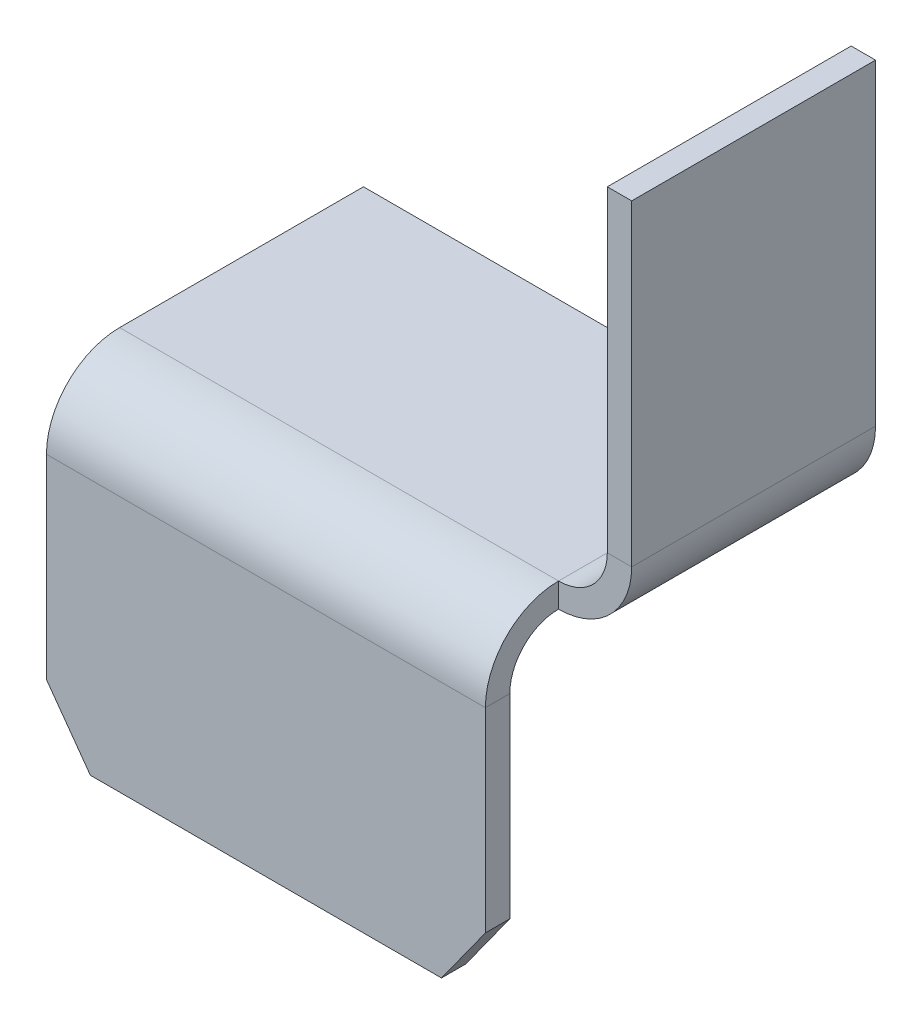
ISO-10303-21;
HEADER;
FILE_DESCRIPTION(('STEP AP214'),'2;1');
FILE_NAME('part.step','',(''),(''),'','','');
FILE_SCHEMA(('AUTOMOTIVE_DESIGN { 1 0 10303 214 1 1 1 1 }'));
ENDSEC;
DATA;
#1=APPLICATION_CONTEXT('core data for automotive mechanical design processes');
#2=APPLICATION_PROTOCOL_DEFINITION('international standard','automotive_design',2000,#1);
#3=PRODUCT_CONTEXT('',#1,'mechanical');
#4=PRODUCT('Part','Part','',(#3));
#5=PRODUCT_RELATED_PRODUCT_CATEGORY('part','',(#4));
#6=PRODUCT_DEFINITION_FORMATION('','',#4);
#7=PRODUCT_DEFINITION_CONTEXT('part definition',#1,'design');
#8=PRODUCT_DEFINITION('design','',#6,#7);
#9=PRODUCT_DEFINITION_SHAPE('','',#8);
#10=(LENGTH_UNIT() NAMED_UNIT(*) SI_UNIT(.MILLI.,.METRE.));
#11=(NAMED_UNIT(*) PLANE_ANGLE_UNIT() SI_UNIT($,.RADIAN.));
#12=(NAMED_UNIT(*) SI_UNIT($,.STERADIAN.) SOLID_ANGLE_UNIT());
#13=UNCERTAINTY_MEASURE_WITH_UNIT(LENGTH_MEASURE(1.E-05),#10,'distance_accuracy_value','');
#14=(GEOMETRIC_REPRESENTATION_CONTEXT(3) GLOBAL_UNCERTAINTY_ASSIGNED_CONTEXT((#13)) GLOBAL_UNIT_ASSIGNED_CONTEXT((#10,
#11,#12)) REPRESENTATION_CONTEXT('',''));
#15=CARTESIAN_POINT('',(0.,0.,0.));
#16=DIRECTION('',(0.,0.,1.));
#17=DIRECTION('',(1.,0.,0.));
#18=AXIS2_PLACEMENT_3D('',#15,#16,#17);
#19=CARTESIAN_POINT('',(20.,2.,10.));
#20=DIRECTION('',(0.,0.,1.));
#21=DIRECTION('',(1.,0.,0.));
#22=AXIS2_PLACEMENT_3D('',#19,#20,#21);
#23=PLANE('',#22);
#24=DIRECTION('',(1.,0.,0.));
#25=VECTOR('',#24,1.);
#26=CARTESIAN_POINT('',(20.,2.,10.));
#27=LINE('',#26,#25);
#28=CARTESIAN_POINT('',(20.,2.,10.));
#29=VERTEX_POINT('',#28);
#30=CARTESIAN_POINT('',(21.,2.,10.));
#31=VERTEX_POINT('',#30);
#32=EDGE_CURVE('E13',#29,#31,#27,.T.);
#33=ORIENTED_EDGE('',*,*,#32,.F.);
#34=CARTESIAN_POINT('',(18.,2.,10.));
#35=DIRECTION('',(0.,0.,-1.));
#36=DIRECTION('',(-1.,0.,0.));
#37=AXIS2_PLACEMENT_3D('',#34,#35,#36);
#38=CIRCLE('',#37,2.);
#39=CARTESIAN_POINT('',(18.,0.,10.));
#40=VERTEX_POINT('',#39);
#41=EDGE_CURVE('E138',#40,#29,#38,.F.);
#42=ORIENTED_EDGE('',*,*,#41,.F.);
#43=DIRECTION('',(0.,1.,0.));
#44=VECTOR('',#43,1.);
#45=CARTESIAN_POINT('',(18.,-1.,10.));
#46=LINE('',#45,#44);
#47=CARTESIAN_POINT('',(18.,-0.999999999999999,10.));
#48=VERTEX_POINT('',#47);
#49=EDGE_CURVE('E78',#48,#40,#46,.T.);
#50=ORIENTED_EDGE('',*,*,#49,.F.);
#51=CARTESIAN_POINT('',(18.,2.,10.));
#52=DIRECTION('',(0.,0.,1.));
#53=DIRECTION('',(1.,0.,0.));
#54=AXIS2_PLACEMENT_3D('',#51,#52,#53);
#55=CIRCLE('',#54,3.);
#56=EDGE_CURVE('E141',#48,#31,#55,.T.);
#57=ORIENTED_EDGE('',*,*,#56,.T.);
#58=EDGE_LOOP('',(#33,#42,#50,#57));
#59=FACE_BOUND('',#58,.T.);
#60=ADVANCED_FACE('F72',(#59),#23,.T.);
#61=CARTESIAN_POINT('',(18.,-1.,10.));
#62=DIRECTION('',(0.,0.,1.));
#63=DIRECTION('',(1.,0.,0.));
#64=AXIS2_PLACEMENT_3D('',#61,#62,#63);
#65=PLANE('',#64);
#66=DIRECTION('',(0.,1.,0.));
#67=VECTOR('',#66,1.);
#68=CARTESIAN_POINT('',(20.,0.,10.));
#69=LINE('',#68,#67);
#70=CARTESIAN_POINT('',(20.,15.,10.));
#71=VERTEX_POINT('',#70);
#72=EDGE_CURVE('E151',#29,#71,#69,.T.);
#73=ORIENTED_EDGE('',*,*,#72,.F.);
#74=ORIENTED_EDGE('',*,*,#32,.T.);
#75=DIRECTION('',(0.,1.,0.));
#76=VECTOR('',#75,1.);
#77=CARTESIAN_POINT('',(21.,0.,10.));
#78=LINE('',#77,#76);
#79=CARTESIAN_POINT('',(21.,15.,10.));
#80=VERTEX_POINT('',#79);
#81=EDGE_CURVE('E126',#31,#80,#78,.T.);
#82=ORIENTED_EDGE('',*,*,#81,.T.);
#83=DIRECTION('',(1.,0.,0.));
#84=VECTOR('',#83,1.);
#85=CARTESIAN_POINT('',(20.,15.,10.));
#86=LINE('',#85,#84);
#87=EDGE_CURVE('E161',#71,#80,#86,.T.);
#88=ORIENTED_EDGE('',*,*,#87,.F.);
#89=EDGE_LOOP('',(#73,#74,#82,#88));
#90=FACE_BOUND('',#89,.T.);
#91=ADVANCED_FACE('F157',(#90),#65,.T.);
#92=CARTESIAN_POINT('',(18.,0.,0.));
#93=DIRECTION('',(0.,0.,-1.));
#94=DIRECTION('',(-1.,0.,0.));
#95=AXIS2_PLACEMENT_3D('',#92,#93,#94);
#96=PLANE('',#95);
#97=DIRECTION('',(0.,-1.,0.));
#98=VECTOR('',#97,1.);
#99=CARTESIAN_POINT('',(18.,0.,0.));
#100=LINE('',#99,#98);
#101=CARTESIAN_POINT('',(18.,0.,0.));
#102=VERTEX_POINT('',#101);
#103=CARTESIAN_POINT('',(18.,-1.,0.));
#104=VERTEX_POINT('',#103);
#105=EDGE_CURVE('E113',#102,#104,#100,.T.);
#106=ORIENTED_EDGE('',*,*,#105,.F.);
#107=CARTESIAN_POINT('',(18.,2.,0.));
#108=DIRECTION('',(0.,0.,-1.));
#109=DIRECTION('',(-1.,0.,0.));
#110=AXIS2_PLACEMENT_3D('',#107,#108,#109);
#111=CIRCLE('',#110,2.);
#112=CARTESIAN_POINT('',(20.,2.,0.));
#113=VERTEX_POINT('',#112);
#114=EDGE_CURVE('E187',#102,#113,#111,.F.);
#115=ORIENTED_EDGE('',*,*,#114,.T.);
#116=DIRECTION('',(-1.,0.,0.));
#117=VECTOR('',#116,1.);
#118=CARTESIAN_POINT('',(21.,2.,0.));
#119=LINE('',#118,#117);
#120=CARTESIAN_POINT('',(21.,2.,0.));
#121=VERTEX_POINT('',#120);
#122=EDGE_CURVE('E124',#121,#113,#119,.T.);
#123=ORIENTED_EDGE('',*,*,#122,.F.);
#124=CARTESIAN_POINT('',(18.,2.,0.));
#125=DIRECTION('',(0.,0.,1.));
#126=DIRECTION('',(1.,0.,0.));
#127=AXIS2_PLACEMENT_3D('',#124,#125,#126);
#128=CIRCLE('',#127,3.);
#129=EDGE_CURVE('E198',#104,#121,#128,.T.);
#130=ORIENTED_EDGE('',*,*,#129,.F.);
#131=EDGE_LOOP('',(#106,#115,#123,#130));
#132=FACE_BOUND('',#131,.T.);
#133=ADVANCED_FACE('F365',(#132),#96,.T.);
#134=CARTESIAN_POINT('',(21.,2.,0.));
#135=DIRECTION('',(0.,0.,-1.));
#136=DIRECTION('',(-1.,0.,0.));
#137=AXIS2_PLACEMENT_3D('',#134,#135,#136);
#138=PLANE('',#137);
#139=DIRECTION('',(1.,0.,0.));
#140=VECTOR('',#139,1.);
#141=CARTESIAN_POINT('',(0.,0.,0.));
#142=LINE('',#141,#140);
#143=CARTESIAN_POINT('',(0.,0.,0.));
#144=VERTEX_POINT('',#143);
#145=EDGE_CURVE('E188',#144,#102,#142,.T.);
#146=ORIENTED_EDGE('',*,*,#145,.T.);
#147=ORIENTED_EDGE('',*,*,#105,.T.);
#148=DIRECTION('',(1.,0.,0.));
#149=VECTOR('',#148,1.);
#150=CARTESIAN_POINT('',(0.,-1.,0.));
#151=LINE('',#150,#149);
#152=CARTESIAN_POINT('',(0.,-1.,0.));
#153=VERTEX_POINT('',#152);
#154=EDGE_CURVE('E191',#153,#104,#151,.T.);
#155=ORIENTED_EDGE('',*,*,#154,.F.);
#156=DIRECTION('',(0.,1.,0.));
#157=VECTOR('',#156,1.);
#158=CARTESIAN_POINT('',(0.,-1.,0.));
#159=LINE('',#158,#157);
#160=EDGE_CURVE('E192',#153,#144,#159,.T.);
#161=ORIENTED_EDGE('',*,*,#160,.T.);
#162=EDGE_LOOP('',(#146,#147,#155,#161));
#163=FACE_BOUND('',#162,.T.);
#164=ADVANCED_FACE('F362',(#163),#138,.T.);
#165=CARTESIAN_POINT('',(21.,0.,10.));
#166=DIRECTION('',(-1.,0.,0.));
#167=DIRECTION('',(0.,0.,1.));
#168=AXIS2_PLACEMENT_3D('',#165,#166,#167);
#169=PLANE('',#168);
#170=DIRECTION('',(0.,1.,0.));
#171=VECTOR('',#170,1.);
#172=CARTESIAN_POINT('',(21.,0.,0.));
#173=LINE('',#172,#171);
#174=CARTESIAN_POINT('',(21.,15.,0.));
#175=VERTEX_POINT('',#174);
#176=EDGE_CURVE('E176',#121,#175,#173,.T.);
#177=ORIENTED_EDGE('',*,*,#176,.T.);
#178=DIRECTION('',(0.,0.,-1.));
#179=VECTOR('',#178,1.);
#180=CARTESIAN_POINT('',(21.,15.,10.));
#181=LINE('',#180,#179);
#182=EDGE_CURVE('E207',#80,#175,#181,.T.);
#183=ORIENTED_EDGE('',*,*,#182,.F.);
#184=ORIENTED_EDGE('',*,*,#81,.F.);
#185=DIRECTION('',(0.,0.,-1.));
#186=VECTOR('',#185,1.);
#187=CARTESIAN_POINT('',(21.,2.,10.));
#188=LINE('',#187,#186);
#189=EDGE_CURVE('E180',#31,#121,#188,.T.);
#190=ORIENTED_EDGE('',*,*,#189,.T.);
#191=EDGE_LOOP('',(#177,#183,#184,#190));
#192=FACE_BOUND('',#191,.T.);
#193=ADVANCED_FACE('F235',(#192),#169,.F.);
#194=CARTESIAN_POINT('',(20.,15.,10.));
#195=DIRECTION('',(0.,1.,0.));
#196=DIRECTION('',(0.,0.,1.));
#197=AXIS2_PLACEMENT_3D('',#194,#195,#196);
#198=PLANE('',#197);
#199=DIRECTION('',(1.,0.,0.));
#200=VECTOR('',#199,1.);
#201=CARTESIAN_POINT('',(20.,15.,0.));
#202=LINE('',#201,#200);
#203=CARTESIAN_POINT('',(20.,15.,0.));
#204=VERTEX_POINT('',#203);
#205=EDGE_CURVE('E185',#204,#175,#202,.T.);
#206=ORIENTED_EDGE('',*,*,#205,.F.);
#207=DIRECTION('',(0.,0.,-1.));
#208=VECTOR('',#207,1.);
#209=CARTESIAN_POINT('',(20.,15.,10.));
#210=LINE('',#209,#208);
#211=EDGE_CURVE('E156',#71,#204,#210,.T.);
#212=ORIENTED_EDGE('',*,*,#211,.F.);
#213=ORIENTED_EDGE('',*,*,#87,.T.);
#214=ORIENTED_EDGE('',*,*,#182,.T.);
#215=EDGE_LOOP('',(#206,#212,#213,#214));
#216=FACE_BOUND('',#215,.T.);
#217=ADVANCED_FACE('F367',(#216),#198,.T.);
#218=CARTESIAN_POINT('',(20.,0.,10.));
#219=DIRECTION('',(-1.,0.,0.));
#220=DIRECTION('',(0.,0.,1.));
#221=AXIS2_PLACEMENT_3D('',#218,#219,#220);
#222=PLANE('',#221);
#223=DIRECTION('',(0.,1.,0.));
#224=VECTOR('',#223,1.);
#225=CARTESIAN_POINT('',(20.,0.,0.));
#226=LINE('',#225,#224);
#227=EDGE_CURVE('E153',#113,#204,#226,.T.);
#228=ORIENTED_EDGE('',*,*,#227,.F.);
#229=DIRECTION('',(0.,0.,-1.));
#230=VECTOR('',#229,1.);
#231=CARTESIAN_POINT('',(20.,2.,10.));
#232=LINE('',#231,#230);
#233=EDGE_CURVE('E149',#29,#113,#232,.T.);
#234=ORIENTED_EDGE('',*,*,#233,.F.);
#235=ORIENTED_EDGE('',*,*,#72,.T.);
#236=ORIENTED_EDGE('',*,*,#211,.T.);
#237=EDGE_LOOP('',(#228,#234,#235,#236));
#238=FACE_BOUND('',#237,.T.);
#239=ADVANCED_FACE('F147',(#238),#222,.T.);
#240=CARTESIAN_POINT('',(18.,2.,10.));
#241=DIRECTION('',(0.,0.,-1.));
#242=DIRECTION('',(-1.,0.,0.));
#243=AXIS2_PLACEMENT_3D('',#240,#241,#242);
#244=CYLINDRICAL_SURFACE('',#243,2.);
#245=ORIENTED_EDGE('',*,*,#114,.F.);
#246=DIRECTION('',(0.,0.,-1.));
#247=VECTOR('',#246,1.);
#248=CARTESIAN_POINT('',(18.,0.,10.));
#249=LINE('',#248,#247);
#250=EDGE_CURVE('E160',#40,#102,#249,.T.);
#251=ORIENTED_EDGE('',*,*,#250,.F.);
#252=ORIENTED_EDGE('',*,*,#41,.T.);
#253=ORIENTED_EDGE('',*,*,#233,.T.);
#254=EDGE_LOOP('',(#245,#251,#252,#253));
#255=FACE_BOUND('',#254,.T.);
#256=ADVANCED_FACE('F163',(#255),#244,.F.);
#257=CARTESIAN_POINT('',(0.,0.,10.));
#258=DIRECTION('',(0.,1.,0.));
#259=DIRECTION('',(0.,0.,1.));
#260=AXIS2_PLACEMENT_3D('',#257,#258,#259);
#261=PLANE('',#260);
#262=ORIENTED_EDGE('',*,*,#145,.F.);
#263=DIRECTION('',(0.,0.,-1.));
#264=VECTOR('',#263,1.);
#265=CARTESIAN_POINT('',(0.,0.,10.));
#266=LINE('',#265,#264);
#267=CARTESIAN_POINT('',(0.,0.,10.));
#268=VERTEX_POINT('',#267);
#269=EDGE_CURVE('E202',#268,#144,#266,.T.);
#270=ORIENTED_EDGE('',*,*,#269,.F.);
#271=DIRECTION('',(1.,0.,0.));
#272=VECTOR('',#271,1.);
#273=CARTESIAN_POINT('',(0.,0.,10.));
#274=LINE('',#273,#272);
#275=EDGE_CURVE('E167',#268,#40,#274,.T.);
#276=ORIENTED_EDGE('',*,*,#275,.T.);
#277=ORIENTED_EDGE('',*,*,#250,.T.);
#278=EDGE_LOOP('',(#262,#270,#276,#277));
#279=FACE_BOUND('',#278,.T.);
#280=ADVANCED_FACE('F359',(#279),#261,.T.);
#281=CARTESIAN_POINT('',(0.,-1.,10.));
#282=DIRECTION('',(-1.,0.,0.));
#283=DIRECTION('',(0.,0.,1.));
#284=AXIS2_PLACEMENT_3D('',#281,#282,#283);
#285=PLANE('',#284);
#286=ORIENTED_EDGE('',*,*,#160,.F.);
#287=DIRECTION('',(0.,0.,-1.));
#288=VECTOR('',#287,1.);
#289=CARTESIAN_POINT('',(0.,-1.,10.));
#290=LINE('',#289,#288);
#291=CARTESIAN_POINT('',(0.,-0.999999999999999,10.));
#292=VERTEX_POINT('',#291);
#293=EDGE_CURVE('E201',#292,#153,#290,.T.);
#294=ORIENTED_EDGE('',*,*,#293,.F.);
#295=DIRECTION('',(0.,1.,0.));
#296=VECTOR('',#295,1.);
#297=CARTESIAN_POINT('',(0.,-1.,10.));
#298=LINE('',#297,#296);
#299=EDGE_CURVE('E169',#292,#268,#298,.T.);
#300=ORIENTED_EDGE('',*,*,#299,.T.);
#301=ORIENTED_EDGE('',*,*,#269,.T.);
#302=EDGE_LOOP('',(#286,#294,#300,#301));
#303=FACE_BOUND('',#302,.T.);
#304=ADVANCED_FACE('F363',(#303),#285,.T.);
#305=CARTESIAN_POINT('',(0.,-1.,10.));
#306=DIRECTION('',(0.,1.,0.));
#307=DIRECTION('',(0.,0.,1.));
#308=AXIS2_PLACEMENT_3D('',#305,#306,#307);
#309=PLANE('',#308);
#310=ORIENTED_EDGE('',*,*,#154,.T.);
#311=DIRECTION('',(0.,0.,-1.));
#312=VECTOR('',#311,1.);
#313=CARTESIAN_POINT('',(18.,-1.,10.));
#314=LINE('',#313,#312);
#315=EDGE_CURVE('E199',#48,#104,#314,.T.);
#316=ORIENTED_EDGE('',*,*,#315,.F.);
#317=DIRECTION('',(1.,0.,0.));
#318=VECTOR('',#317,1.);
#319=CARTESIAN_POINT('',(0.,-1.,10.));
#320=LINE('',#319,#318);
#321=EDGE_CURVE('E173',#292,#48,#320,.T.);
#322=ORIENTED_EDGE('',*,*,#321,.F.);
#323=ORIENTED_EDGE('',*,*,#293,.T.);
#324=EDGE_LOOP('',(#310,#316,#322,#323));
#325=FACE_BOUND('',#324,.T.);
#326=ADVANCED_FACE('F229',(#325),#309,.F.);
#327=CARTESIAN_POINT('',(18.,2.,10.));
#328=DIRECTION('',(0.,0.,-1.));
#329=DIRECTION('',(-1.,0.,0.));
#330=AXIS2_PLACEMENT_3D('',#327,#328,#329);
#331=CYLINDRICAL_SURFACE('',#330,3.);
#332=ORIENTED_EDGE('',*,*,#129,.T.);
#333=ORIENTED_EDGE('',*,*,#189,.F.);
#334=ORIENTED_EDGE('',*,*,#56,.F.);
#335=ORIENTED_EDGE('',*,*,#315,.T.);
#336=EDGE_LOOP('',(#332,#333,#334,#335));
#337=FACE_BOUND('',#336,.T.);
#338=ADVANCED_FACE('F230',(#337),#331,.T.);
#339=CARTESIAN_POINT('',(18.,2.,0.));
#340=DIRECTION('',(0.,0.,-1.));
#341=DIRECTION('',(-1.,0.,0.));
#342=AXIS2_PLACEMENT_3D('',#339,#340,#341);
#343=PLANE('',#342);
#344=ORIENTED_EDGE('',*,*,#176,.F.);
#345=ORIENTED_EDGE('',*,*,#122,.T.);
#346=ORIENTED_EDGE('',*,*,#227,.T.);
#347=ORIENTED_EDGE('',*,*,#205,.T.);
#348=EDGE_LOOP('',(#344,#345,#346,#347));
#349=FACE_BOUND('',#348,.T.);
#350=ADVANCED_FACE('F464',(#349),#343,.T.);
#351=CARTESIAN_POINT('',(18.,-3.,10.));
#352=DIRECTION('',(1.,0.,0.));
#353=DIRECTION('',(0.,0.,-1.));
#354=AXIS2_PLACEMENT_3D('',#351,#352,#353);
#355=PLANE('',#354);
#356=DIRECTION('',(0.,0.,-1.));
#357=VECTOR('',#356,1.);
#358=CARTESIAN_POINT('',(18.,-3.,13.));
#359=LINE('',#358,#357);
#360=CARTESIAN_POINT('',(18.,-3.,12.));
#361=VERTEX_POINT('',#360);
#362=CARTESIAN_POINT('',(18.,-3.,13.));
#363=VERTEX_POINT('',#362);
#364=EDGE_CURVE('E245',#361,#363,#359,.F.);
#365=ORIENTED_EDGE('',*,*,#364,.F.);
#366=CARTESIAN_POINT('',(18.,-3.,10.));
#367=DIRECTION('',(-1.,0.,0.));
#368=DIRECTION('',(0.,0.,1.));
#369=AXIS2_PLACEMENT_3D('',#366,#367,#368);
#370=CIRCLE('',#369,2.);
#371=EDGE_CURVE('E225',#48,#361,#370,.F.);
#372=ORIENTED_EDGE('',*,*,#371,.F.);
#373=ORIENTED_EDGE('',*,*,#49,.T.);
#374=CARTESIAN_POINT('',(18.,-3.,10.));
#375=DIRECTION('',(-1.,0.,0.));
#376=DIRECTION('',(0.,0.,1.));
#377=AXIS2_PLACEMENT_3D('',#374,#375,#376);
#378=CIRCLE('',#377,3.);
#379=EDGE_CURVE('E181',#40,#363,#378,.F.);
#380=ORIENTED_EDGE('',*,*,#379,.T.);
#381=EDGE_LOOP('',(#365,#372,#373,#380));
#382=FACE_BOUND('',#381,.T.);
#383=ADVANCED_FACE('F220',(#382),#355,.T.);
#384=CARTESIAN_POINT('',(0.,-3.,10.));
#385=DIRECTION('',(1.,0.,0.));
#386=DIRECTION('',(0.,0.,-1.));
#387=AXIS2_PLACEMENT_3D('',#384,#385,#386);
#388=PLANE('',#387);
#389=CARTESIAN_POINT('',(0.,-3.,10.));
#390=DIRECTION('',(-1.,0.,0.));
#391=DIRECTION('',(0.,0.,1.));
#392=AXIS2_PLACEMENT_3D('',#389,#390,#391);
#393=CIRCLE('',#392,2.);
#394=CARTESIAN_POINT('',(0.,-3.,12.));
#395=VERTEX_POINT('',#394);
#396=EDGE_CURVE('E237',#395,#292,#393,.T.);
#397=ORIENTED_EDGE('',*,*,#396,.F.);
#398=DIRECTION('',(0.,0.,-1.));
#399=VECTOR('',#398,1.);
#400=CARTESIAN_POINT('',(0.,-3.,12.));
#401=LINE('',#400,#399);
#402=CARTESIAN_POINT('',(0.,-3.,13.));
#403=VERTEX_POINT('',#402);
#404=EDGE_CURVE('E248',#395,#403,#401,.F.);
#405=ORIENTED_EDGE('',*,*,#404,.T.);
#406=CARTESIAN_POINT('',(0.,-3.,10.));
#407=DIRECTION('',(-1.,0.,0.));
#408=DIRECTION('',(0.,0.,1.));
#409=AXIS2_PLACEMENT_3D('',#406,#407,#408);
#410=CIRCLE('',#409,3.);
#411=EDGE_CURVE('E241',#403,#268,#410,.T.);
#412=ORIENTED_EDGE('',*,*,#411,.T.);
#413=ORIENTED_EDGE('',*,*,#299,.F.);
#414=EDGE_LOOP('',(#397,#405,#412,#413));
#415=FACE_BOUND('',#414,.T.);
#416=ADVANCED_FACE('F355',(#415),#388,.F.);
#417=CARTESIAN_POINT('',(0.,-3.,10.));
#418=DIRECTION('',(-1.,0.,0.));
#419=DIRECTION('',(0.,0.,1.));
#420=AXIS2_PLACEMENT_3D('',#417,#418,#419);
#421=CYLINDRICAL_SURFACE('',#420,3.);
#422=ORIENTED_EDGE('',*,*,#275,.F.);
#423=ORIENTED_EDGE('',*,*,#411,.F.);
#424=DIRECTION('',(-1.,0.,0.));
#425=VECTOR('',#424,1.);
#426=CARTESIAN_POINT('',(0.,-3.,13.));
#427=LINE('',#426,#425);
#428=EDGE_CURVE('E251',#363,#403,#427,.T.);
#429=ORIENTED_EDGE('',*,*,#428,.F.);
#430=ORIENTED_EDGE('',*,*,#379,.F.);
#431=EDGE_LOOP('',(#422,#423,#429,#430));
#432=FACE_BOUND('',#431,.T.);
#433=ADVANCED_FACE('F348',(#432),#421,.T.);
#434=CARTESIAN_POINT('',(0.,-3.,10.));
#435=DIRECTION('',(-1.,0.,0.));
#436=DIRECTION('',(0.,0.,1.));
#437=AXIS2_PLACEMENT_3D('',#434,#435,#436);
#438=CYLINDRICAL_SURFACE('',#437,2.);
#439=ORIENTED_EDGE('',*,*,#321,.T.);
#440=ORIENTED_EDGE('',*,*,#371,.T.);
#441=DIRECTION('',(1.,0.,0.));
#442=VECTOR('',#441,1.);
#443=CARTESIAN_POINT('',(18.,-3.,12.));
#444=LINE('',#443,#442);
#445=EDGE_CURVE('E249',#361,#395,#444,.F.);
#446=ORIENTED_EDGE('',*,*,#445,.T.);
#447=ORIENTED_EDGE('',*,*,#396,.T.);
#448=EDGE_LOOP('',(#439,#440,#446,#447));
#449=FACE_BOUND('',#448,.T.);
#450=ADVANCED_FACE('F498',(#449),#438,.F.);
#451=CARTESIAN_POINT('',(0.,-1.,13.));
#452=DIRECTION('',(1.,0.,0.));
#453=DIRECTION('',(0.,0.,-1.));
#454=AXIS2_PLACEMENT_3D('',#451,#452,#453);
#455=PLANE('',#454);
#456=ORIENTED_EDGE('',*,*,#404,.F.);
#457=DIRECTION('',(0.,-1.,0.));
#458=VECTOR('',#457,1.);
#459=CARTESIAN_POINT('',(0.,-1.,12.));
#460=LINE('',#459,#458);
#461=CARTESIAN_POINT('',(0.,-11.,12.));
#462=VERTEX_POINT('',#461);
#463=EDGE_CURVE('E258',#395,#462,#460,.T.);
#464=ORIENTED_EDGE('',*,*,#463,.T.);
#465=DIRECTION('',(0.,0.,-1.));
#466=VECTOR('',#465,1.);
#467=CARTESIAN_POINT('',(0.,-11.,13.));
#468=LINE('',#467,#466);
#469=CARTESIAN_POINT('',(0.,-11.,13.));
#470=VERTEX_POINT('',#469);
#471=EDGE_CURVE('E239',#470,#462,#468,.T.);
#472=ORIENTED_EDGE('',*,*,#471,.F.);
#473=DIRECTION('',(0.,1.,0.));
#474=VECTOR('',#473,1.);
#475=CARTESIAN_POINT('',(0.,0.,13.));
#476=LINE('',#475,#474);
#477=EDGE_CURVE('E271',#403,#470,#476,.F.);
#478=ORIENTED_EDGE('',*,*,#477,.F.);
#479=EDGE_LOOP('',(#456,#464,#472,#478));
#480=FACE_BOUND('',#479,.T.);
#481=ADVANCED_FACE('F310',(#480),#455,.F.);
#482=CARTESIAN_POINT('',(18.,-1.,13.));
#483=DIRECTION('',(-1.,0.,0.));
#484=DIRECTION('',(0.,0.,1.));
#485=AXIS2_PLACEMENT_3D('',#482,#483,#484);
#486=PLANE('',#485);
#487=ORIENTED_EDGE('',*,*,#364,.T.);
#488=DIRECTION('',(0.,-1.,0.));
#489=VECTOR('',#488,1.);
#490=CARTESIAN_POINT('',(18.,0.,13.));
#491=LINE('',#490,#489);
#492=CARTESIAN_POINT('',(18.,-11.,13.));
#493=VERTEX_POINT('',#492);
#494=EDGE_CURVE('E284',#493,#363,#491,.F.);
#495=ORIENTED_EDGE('',*,*,#494,.F.);
#496=DIRECTION('',(0.,0.,-1.));
#497=VECTOR('',#496,1.);
#498=CARTESIAN_POINT('',(18.,-11.,13.));
#499=LINE('',#498,#497);
#500=CARTESIAN_POINT('',(18.,-11.,12.));
#501=VERTEX_POINT('',#500);
#502=EDGE_CURVE('E287',#493,#501,#499,.T.);
#503=ORIENTED_EDGE('',*,*,#502,.T.);
#504=DIRECTION('',(0.,1.,0.));
#505=VECTOR('',#504,1.);
#506=CARTESIAN_POINT('',(18.,-1.,12.));
#507=LINE('',#506,#505);
#508=EDGE_CURVE('E268',#501,#361,#507,.T.);
#509=ORIENTED_EDGE('',*,*,#508,.T.);
#510=EDGE_LOOP('',(#487,#495,#503,#509));
#511=FACE_BOUND('',#510,.T.);
#512=ADVANCED_FACE('F349',(#511),#486,.F.);
#513=CARTESIAN_POINT('',(0.,0.,13.));
#514=DIRECTION('',(0.,0.,1.));
#515=DIRECTION('',(1.,0.,0.));
#516=AXIS2_PLACEMENT_3D('',#513,#514,#515);
#517=PLANE('',#516);
#518=ORIENTED_EDGE('',*,*,#494,.T.);
#519=ORIENTED_EDGE('',*,*,#428,.T.);
#520=ORIENTED_EDGE('',*,*,#477,.T.);
#521=DIRECTION('',(-0.584304725845076,0.811534341451495,0.));
#522=VECTOR('',#521,1.);
#523=CARTESIAN_POINT('',(-5.21601685985248,-3.75553213909378,13.));
#524=LINE('',#523,#522);
#525=CARTESIAN_POINT('',(1.8,-13.5,13.));
#526=VERTEX_POINT('',#525);
#527=EDGE_CURVE('E273',#470,#526,#524,.F.);
#528=ORIENTED_EDGE('',*,*,#527,.T.);
#529=DIRECTION('',(-1.,0.,0.));
#530=VECTOR('',#529,1.);
#531=CARTESIAN_POINT('',(0.,-13.5,13.));
#532=LINE('',#531,#530);
#533=CARTESIAN_POINT('',(16.2,-13.5,13.));
#534=VERTEX_POINT('',#533);
#535=EDGE_CURVE('E280',#526,#534,#532,.F.);
#536=ORIENTED_EDGE('',*,*,#535,.T.);
#537=DIRECTION('',(-0.584304725845076,-0.811534341451495,0.));
#538=VECTOR('',#537,1.);
#539=CARTESIAN_POINT('',(17.0706006322445,-12.290832455216,13.));
#540=LINE('',#539,#538);
#541=EDGE_CURVE('E278',#534,#493,#540,.F.);
#542=ORIENTED_EDGE('',*,*,#541,.T.);
#543=EDGE_LOOP('',(#518,#519,#520,#528,#536,#542));
#544=FACE_BOUND('',#543,.T.);
#545=ADVANCED_FACE('F337',(#544),#517,.T.);
#546=CARTESIAN_POINT('',(0.,0.,12.));
#547=DIRECTION('',(0.,0.,1.));
#548=DIRECTION('',(1.,0.,0.));
#549=AXIS2_PLACEMENT_3D('',#546,#547,#548);
#550=PLANE('',#549);
#551=ORIENTED_EDGE('',*,*,#445,.F.);
#552=ORIENTED_EDGE('',*,*,#508,.F.);
#553=DIRECTION('',(0.584304725845076,0.811534341451495,0.));
#554=VECTOR('',#553,1.);
#555=CARTESIAN_POINT('',(16.2,-13.5,12.));
#556=LINE('',#555,#554);
#557=CARTESIAN_POINT('',(16.2,-13.5,12.));
#558=VERTEX_POINT('',#557);
#559=EDGE_CURVE('E264',#558,#501,#556,.T.);
#560=ORIENTED_EDGE('',*,*,#559,.F.);
#561=DIRECTION('',(1.,0.,0.));
#562=VECTOR('',#561,1.);
#563=CARTESIAN_POINT('',(1.8,-13.5,12.));
#564=LINE('',#563,#562);
#565=CARTESIAN_POINT('',(1.8,-13.5,12.));
#566=VERTEX_POINT('',#565);
#567=EDGE_CURVE('E265',#566,#558,#564,.T.);
#568=ORIENTED_EDGE('',*,*,#567,.F.);
#569=DIRECTION('',(0.584304725845076,-0.811534341451495,0.));
#570=VECTOR('',#569,1.);
#571=CARTESIAN_POINT('',(0.,-11.,12.));
#572=LINE('',#571,#570);
#573=EDGE_CURVE('E259',#462,#566,#572,.T.);
#574=ORIENTED_EDGE('',*,*,#573,.F.);
#575=ORIENTED_EDGE('',*,*,#463,.F.);
#576=EDGE_LOOP('',(#551,#552,#560,#568,#574,#575));
#577=FACE_BOUND('',#576,.T.);
#578=ADVANCED_FACE('F538',(#577),#550,.F.);
#579=CARTESIAN_POINT('',(0.,-11.,13.));
#580=DIRECTION('',(0.811534341451495,0.584304725845076,0.));
#581=DIRECTION('',(-0.584304725845076,0.811534341451495,0.));
#582=AXIS2_PLACEMENT_3D('',#579,#580,#581);
#583=PLANE('',#582);
#584=ORIENTED_EDGE('',*,*,#573,.T.);
#585=DIRECTION('',(0.,0.,-1.));
#586=VECTOR('',#585,1.);
#587=CARTESIAN_POINT('',(1.8,-13.5,13.));
#588=LINE('',#587,#586);
#589=EDGE_CURVE('E295',#526,#566,#588,.T.);
#590=ORIENTED_EDGE('',*,*,#589,.F.);
#591=ORIENTED_EDGE('',*,*,#527,.F.);
#592=ORIENTED_EDGE('',*,*,#471,.T.);
#593=EDGE_LOOP('',(#584,#590,#591,#592));
#594=FACE_BOUND('',#593,.T.);
#595=ADVANCED_FACE('F300',(#594),#583,.F.);
#596=CARTESIAN_POINT('',(1.8,-13.5,13.));
#597=DIRECTION('',(0.,1.,0.));
#598=DIRECTION('',(0.,0.,1.));
#599=AXIS2_PLACEMENT_3D('',#596,#597,#598);
#600=PLANE('',#599);
#601=ORIENTED_EDGE('',*,*,#567,.T.);
#602=DIRECTION('',(0.,0.,-1.));
#603=VECTOR('',#602,1.);
#604=CARTESIAN_POINT('',(16.2,-13.5,13.));
#605=LINE('',#604,#603);
#606=EDGE_CURVE('E286',#534,#558,#605,.T.);
#607=ORIENTED_EDGE('',*,*,#606,.F.);
#608=ORIENTED_EDGE('',*,*,#535,.F.);
#609=ORIENTED_EDGE('',*,*,#589,.T.);
#610=EDGE_LOOP('',(#601,#607,#608,#609));
#611=FACE_BOUND('',#610,.T.);
#612=ADVANCED_FACE('F342',(#611),#600,.F.);
#613=CARTESIAN_POINT('',(16.2,-13.5,13.));
#614=DIRECTION('',(-0.811534341451495,0.584304725845076,0.));
#615=DIRECTION('',(-0.584304725845076,-0.811534341451495,0.));
#616=AXIS2_PLACEMENT_3D('',#613,#614,#615);
#617=PLANE('',#616);
#618=ORIENTED_EDGE('',*,*,#559,.T.);
#619=ORIENTED_EDGE('',*,*,#502,.F.);
#620=ORIENTED_EDGE('',*,*,#541,.F.);
#621=ORIENTED_EDGE('',*,*,#606,.T.);
#622=EDGE_LOOP('',(#618,#619,#620,#621));
#623=FACE_BOUND('',#622,.T.);
#624=ADVANCED_FACE('F343',(#623),#617,.F.);
#625=CLOSED_SHELL('',(#60,#91,#133,#164,#193,#217,#239,#256,#280,#304,#326,#338,#350,#383,#416,
#433,#450,#481,#512,#545,#578,#595,#612,#624));
#626=MANIFOLD_SOLID_BREP('B2',#625);
#627=ADVANCED_BREP_SHAPE_REPRESENTATION('',(#18,#626),#14);
#628=SHAPE_DEFINITION_REPRESENTATION(#9,#627);
ENDSEC;
END-ISO-10303-21;
